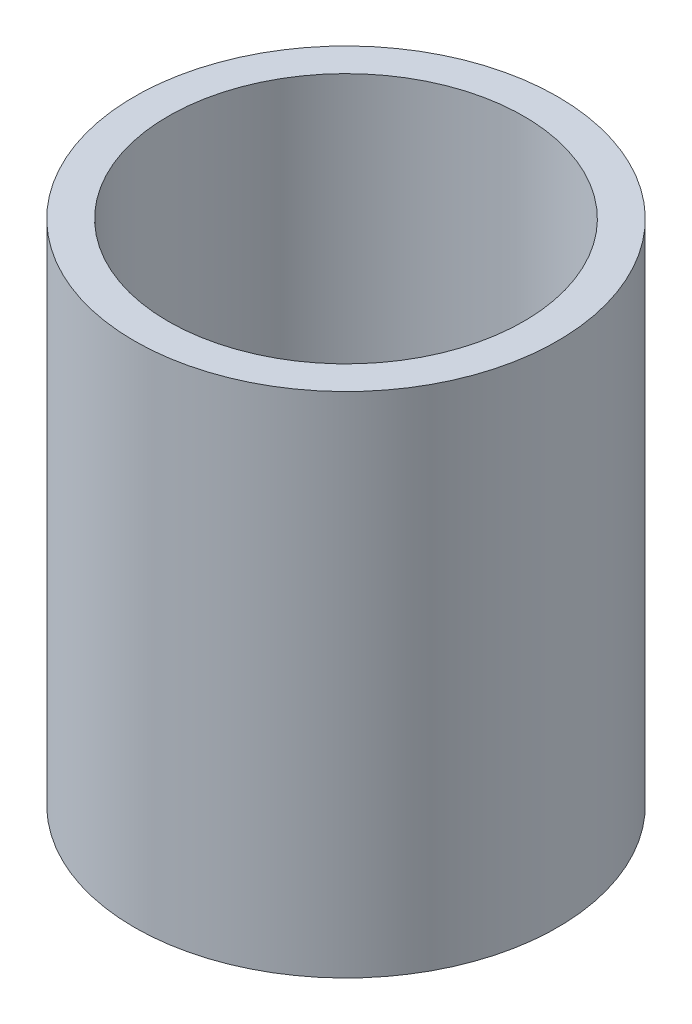
ISO-10303-21;
HEADER;
FILE_DESCRIPTION(('STEP AP214'),'2;1');
FILE_NAME('part.step','',(''),(''),'','','');
FILE_SCHEMA(('AUTOMOTIVE_DESIGN { 1 0 10303 214 1 1 1 1 }'));
ENDSEC;
DATA;
#1=APPLICATION_CONTEXT('core data for automotive mechanical design processes');
#2=APPLICATION_PROTOCOL_DEFINITION('international standard','automotive_design',2000,#1);
#3=PRODUCT_CONTEXT('',#1,'mechanical');
#4=PRODUCT('Part','Part','',(#3));
#5=PRODUCT_RELATED_PRODUCT_CATEGORY('part','',(#4));
#6=PRODUCT_DEFINITION_FORMATION('','',#4);
#7=PRODUCT_DEFINITION_CONTEXT('part definition',#1,'design');
#8=PRODUCT_DEFINITION('design','',#6,#7);
#9=PRODUCT_DEFINITION_SHAPE('','',#8);
#10=(LENGTH_UNIT() NAMED_UNIT(*) SI_UNIT(.MILLI.,.METRE.));
#11=(NAMED_UNIT(*) PLANE_ANGLE_UNIT() SI_UNIT($,.RADIAN.));
#12=(NAMED_UNIT(*) SI_UNIT($,.STERADIAN.) SOLID_ANGLE_UNIT());
#13=UNCERTAINTY_MEASURE_WITH_UNIT(LENGTH_MEASURE(1.E-05),#10,'distance_accuracy_value','');
#14=(GEOMETRIC_REPRESENTATION_CONTEXT(3) GLOBAL_UNCERTAINTY_ASSIGNED_CONTEXT((#13)) GLOBAL_UNIT_ASSIGNED_CONTEXT((#10,
#11,#12)) REPRESENTATION_CONTEXT('',''));
#15=CARTESIAN_POINT('',(0.,0.,0.));
#16=DIRECTION('',(0.,0.,1.));
#17=DIRECTION('',(1.,0.,0.));
#18=AXIS2_PLACEMENT_3D('',#15,#16,#17);
#19=CARTESIAN_POINT('',(0.,30.,0.));
#20=DIRECTION('',(0.,1.,0.));
#21=DIRECTION('',(0.,0.,1.));
#22=AXIS2_PLACEMENT_3D('',#19,#20,#21);
#23=PLANE('',#22);
#24=CARTESIAN_POINT('',(0.,30.,0.));
#25=DIRECTION('',(0.,1.,0.));
#26=DIRECTION('',(0.,0.,1.));
#27=AXIS2_PLACEMENT_3D('',#24,#25,#26);
#28=CIRCLE('',#27,12.5);
#29=CARTESIAN_POINT('',(0.,30.,12.5));
#30=VERTEX_POINT('',#29);
#31=EDGE_CURVE('E10',#30,#30,#28,.T.);
#32=ORIENTED_EDGE('',*,*,#31,.T.);
#33=EDGE_LOOP('',(#32));
#34=FACE_BOUND('',#33,.T.);
#35=CARTESIAN_POINT('',(0.,30.,0.));
#36=DIRECTION('',(0.,1.,0.));
#37=DIRECTION('',(0.,0.,1.));
#38=AXIS2_PLACEMENT_3D('',#35,#36,#37);
#39=CIRCLE('',#38,10.5);
#40=CARTESIAN_POINT('',(0.,30.,10.5));
#41=VERTEX_POINT('',#40);
#42=EDGE_CURVE('E54',#41,#41,#39,.T.);
#43=ORIENTED_EDGE('',*,*,#42,.F.);
#44=EDGE_LOOP('',(#43));
#45=FACE_BOUND('',#44,.T.);
#46=ADVANCED_FACE('F41',(#34,#45),#23,.T.);
#47=CARTESIAN_POINT('',(0.,0.,0.));
#48=DIRECTION('',(0.,1.,0.));
#49=DIRECTION('',(0.,0.,1.));
#50=AXIS2_PLACEMENT_3D('',#47,#48,#49);
#51=PLANE('',#50);
#52=CARTESIAN_POINT('',(0.,0.,0.));
#53=DIRECTION('',(0.,1.,0.));
#54=DIRECTION('',(0.,0.,1.));
#55=AXIS2_PLACEMENT_3D('',#52,#53,#54);
#56=CIRCLE('',#55,12.5);
#57=CARTESIAN_POINT('',(0.,0.,12.5));
#58=VERTEX_POINT('',#57);
#59=EDGE_CURVE('E45',#58,#58,#56,.T.);
#60=ORIENTED_EDGE('',*,*,#59,.F.);
#61=EDGE_LOOP('',(#60));
#62=FACE_BOUND('',#61,.T.);
#63=CARTESIAN_POINT('',(0.,0.,0.));
#64=DIRECTION('',(0.,1.,0.));
#65=DIRECTION('',(0.,0.,1.));
#66=AXIS2_PLACEMENT_3D('',#63,#64,#65);
#67=CIRCLE('',#66,10.5);
#68=CARTESIAN_POINT('',(0.,0.,10.5));
#69=VERTEX_POINT('',#68);
#70=EDGE_CURVE('E56',#69,#69,#67,.T.);
#71=ORIENTED_EDGE('',*,*,#70,.T.);
#72=EDGE_LOOP('',(#71));
#73=FACE_BOUND('',#72,.T.);
#74=ADVANCED_FACE('F68',(#62,#73),#51,.F.);
#75=CARTESIAN_POINT('',(0.,30.,0.));
#76=DIRECTION('',(0.,-1.,0.));
#77=DIRECTION('',(0.,0.,-1.));
#78=AXIS2_PLACEMENT_3D('',#75,#76,#77);
#79=CYLINDRICAL_SURFACE('',#78,12.5);
#80=ORIENTED_EDGE('',*,*,#31,.F.);
#81=EDGE_LOOP('',(#80));
#82=FACE_BOUND('',#81,.T.);
#83=ORIENTED_EDGE('',*,*,#59,.T.);
#84=EDGE_LOOP('',(#83));
#85=FACE_BOUND('',#84,.T.);
#86=ADVANCED_FACE('F43',(#82,#85),#79,.T.);
#87=CARTESIAN_POINT('',(0.,30.,0.));
#88=DIRECTION('',(0.,-1.,0.));
#89=DIRECTION('',(0.,0.,-1.));
#90=AXIS2_PLACEMENT_3D('',#87,#88,#89);
#91=CYLINDRICAL_SURFACE('',#90,10.5);
#92=ORIENTED_EDGE('',*,*,#42,.T.);
#93=EDGE_LOOP('',(#92));
#94=FACE_BOUND('',#93,.T.);
#95=ORIENTED_EDGE('',*,*,#70,.F.);
#96=EDGE_LOOP('',(#95));
#97=FACE_BOUND('',#96,.T.);
#98=ADVANCED_FACE('F64',(#94,#97),#91,.F.);
#99=CLOSED_SHELL('',(#46,#74,#86,#98));
#100=MANIFOLD_SOLID_BREP('B2',#99);
#101=ADVANCED_BREP_SHAPE_REPRESENTATION('',(#18,#100),#14);
#102=SHAPE_DEFINITION_REPRESENTATION(#9,#101);
ENDSEC;
END-ISO-10303-21;
